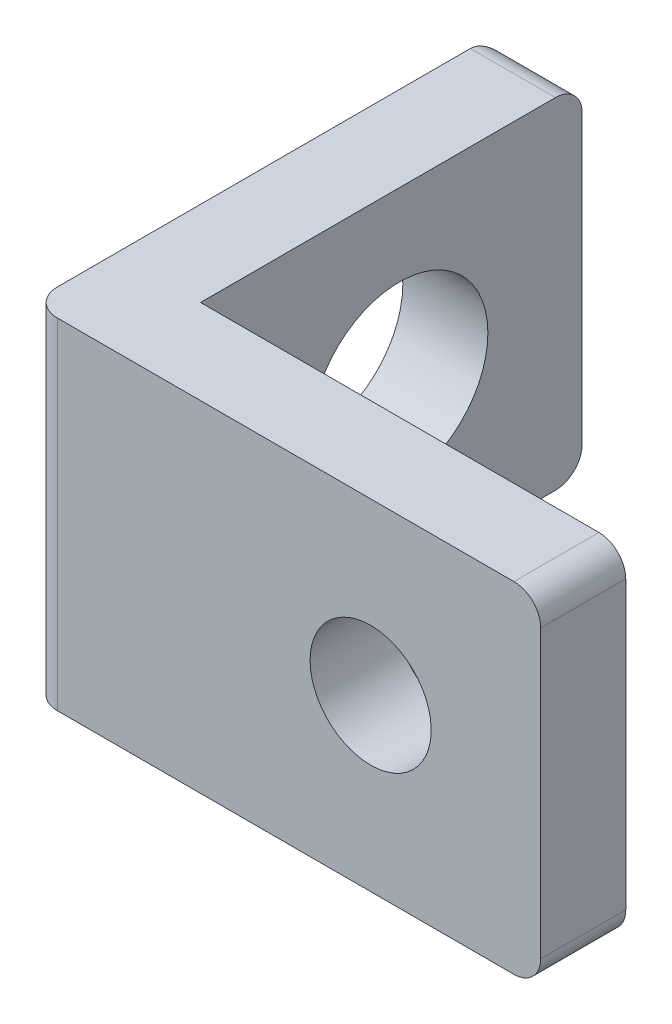
ISO-10303-21;
HEADER;
FILE_DESCRIPTION(('STEP AP214'),'2;1');
FILE_NAME('part.step','',(''),(''),'','','');
FILE_SCHEMA(('AUTOMOTIVE_DESIGN { 1 0 10303 214 1 1 1 1 }'));
ENDSEC;
DATA;
#1=APPLICATION_CONTEXT('core data for automotive mechanical design processes');
#2=APPLICATION_PROTOCOL_DEFINITION('international standard','automotive_design',2000,#1);
#3=PRODUCT_CONTEXT('',#1,'mechanical');
#4=PRODUCT('Part','Part','',(#3));
#5=PRODUCT_RELATED_PRODUCT_CATEGORY('part','',(#4));
#6=PRODUCT_DEFINITION_FORMATION('','',#4);
#7=PRODUCT_DEFINITION_CONTEXT('part definition',#1,'design');
#8=PRODUCT_DEFINITION('design','',#6,#7);
#9=PRODUCT_DEFINITION_SHAPE('','',#8);
#10=(LENGTH_UNIT() NAMED_UNIT(*) SI_UNIT(.MILLI.,.METRE.));
#11=(NAMED_UNIT(*) PLANE_ANGLE_UNIT() SI_UNIT($,.RADIAN.));
#12=(NAMED_UNIT(*) SI_UNIT($,.STERADIAN.) SOLID_ANGLE_UNIT());
#13=UNCERTAINTY_MEASURE_WITH_UNIT(LENGTH_MEASURE(1.E-05),#10,'distance_accuracy_value','');
#14=(GEOMETRIC_REPRESENTATION_CONTEXT(3) GLOBAL_UNCERTAINTY_ASSIGNED_CONTEXT((#13)) GLOBAL_UNIT_ASSIGNED_CONTEXT((#10,
#11,#12)) REPRESENTATION_CONTEXT('',''));
#15=CARTESIAN_POINT('',(0.,0.,0.));
#16=DIRECTION('',(0.,0.,1.));
#17=DIRECTION('',(1.,0.,0.));
#18=AXIS2_PLACEMENT_3D('',#15,#16,#17);
#19=CARTESIAN_POINT('',(1.5875,6.35,0.));
#20=DIRECTION('',(1.,0.,0.));
#21=DIRECTION('',(0.,0.,-1.));
#22=AXIS2_PLACEMENT_3D('',#19,#20,#21);
#23=PLANE('',#22);
#24=CARTESIAN_POINT('',(1.5875,3.175,-5.3));
#25=DIRECTION('',(1.,0.,0.));
#26=DIRECTION('',(0.,0.,-1.));
#27=AXIS2_PLACEMENT_3D('',#24,#25,#26);
#28=CIRCLE('',#27,1.651);
#29=CARTESIAN_POINT('',(1.5875,3.175,-6.951));
#30=VERTEX_POINT('',#29);
#31=EDGE_CURVE('E213',#30,#30,#28,.T.);
#32=ORIENTED_EDGE('',*,*,#31,.F.);
#33=EDGE_LOOP('',(#32));
#34=FACE_BOUND('',#33,.T.);
#35=DIRECTION('',(0.,0.,1.));
#36=VECTOR('',#35,1.);
#37=CARTESIAN_POINT('',(1.5875,0.,0.));
#38=LINE('',#37,#36);
#39=CARTESIAN_POINT('',(1.5875,0.,-8.2122));
#40=VERTEX_POINT('',#39);
#41=CARTESIAN_POINT('',(1.5875,0.,-1.5875));
#42=VERTEX_POINT('',#41);
#43=EDGE_CURVE('E216',#40,#42,#38,.T.);
#44=ORIENTED_EDGE('',*,*,#43,.F.);
#45=CARTESIAN_POINT('',(1.5875,0.5,-8.2122));
#46=DIRECTION('',(1.,0.,0.));
#47=DIRECTION('',(0.,0.,-1.));
#48=AXIS2_PLACEMENT_3D('',#45,#46,#47);
#49=CIRCLE('',#48,0.5);
#50=CARTESIAN_POINT('',(1.5875,0.5,-8.7122));
#51=VERTEX_POINT('',#50);
#52=EDGE_CURVE('E177',#40,#51,#49,.T.);
#53=ORIENTED_EDGE('',*,*,#52,.T.);
#54=DIRECTION('',(0.,-1.,0.));
#55=VECTOR('',#54,1.);
#56=CARTESIAN_POINT('',(1.5875,6.35,-8.7122));
#57=LINE('',#56,#55);
#58=CARTESIAN_POINT('',(1.5875,5.85,-8.7122));
#59=VERTEX_POINT('',#58);
#60=EDGE_CURVE('E156',#59,#51,#57,.T.);
#61=ORIENTED_EDGE('',*,*,#60,.F.);
#62=CARTESIAN_POINT('',(1.5875,5.85,-8.2122));
#63=DIRECTION('',(1.,0.,0.));
#64=DIRECTION('',(0.,0.,-1.));
#65=AXIS2_PLACEMENT_3D('',#62,#63,#64);
#66=CIRCLE('',#65,0.5);
#67=CARTESIAN_POINT('',(1.5875,6.35,-8.2122));
#68=VERTEX_POINT('',#67);
#69=EDGE_CURVE('E140',#59,#68,#66,.T.);
#70=ORIENTED_EDGE('',*,*,#69,.T.);
#71=DIRECTION('',(0.,0.,1.));
#72=VECTOR('',#71,1.);
#73=CARTESIAN_POINT('',(1.5875,6.35,0.));
#74=LINE('',#73,#72);
#75=CARTESIAN_POINT('',(1.5875,6.35,-1.5875));
#76=VERTEX_POINT('',#75);
#77=EDGE_CURVE('E125',#68,#76,#74,.T.);
#78=ORIENTED_EDGE('',*,*,#77,.T.);
#79=DIRECTION('',(0.,-1.,0.));
#80=VECTOR('',#79,1.);
#81=CARTESIAN_POINT('',(1.5875,6.35,-1.5875));
#82=LINE('',#81,#80);
#83=EDGE_CURVE('E132',#76,#42,#82,.T.);
#84=ORIENTED_EDGE('',*,*,#83,.T.);
#85=EDGE_LOOP('',(#44,#53,#61,#70,#78,#84));
#86=FACE_BOUND('',#85,.T.);
#87=ADVANCED_FACE('F36',(#34,#86),#23,.T.);
#88=CARTESIAN_POINT('',(0.,6.35,-8.7122));
#89=DIRECTION('',(0.,0.,-1.));
#90=DIRECTION('',(-1.,0.,0.));
#91=AXIS2_PLACEMENT_3D('',#88,#89,#90);
#92=PLANE('',#91);
#93=ORIENTED_EDGE('',*,*,#60,.T.);
#94=DIRECTION('',(1.,0.,0.));
#95=VECTOR('',#94,1.);
#96=CARTESIAN_POINT('',(0.,0.5,-8.7122));
#97=LINE('',#96,#95);
#98=CARTESIAN_POINT('',(0.5,0.5,-8.7122));
#99=VERTEX_POINT('',#98);
#100=EDGE_CURVE('E168',#51,#99,#97,.F.);
#101=ORIENTED_EDGE('',*,*,#100,.T.);
#102=DIRECTION('',(0.,-1.,0.));
#103=VECTOR('',#102,1.);
#104=CARTESIAN_POINT('',(0.5,6.35,-8.7122));
#105=LINE('',#104,#103);
#106=CARTESIAN_POINT('',(0.5,5.85,-8.7122));
#107=VERTEX_POINT('',#106);
#108=EDGE_CURVE('E166',#99,#107,#105,.F.);
#109=ORIENTED_EDGE('',*,*,#108,.T.);
#110=DIRECTION('',(1.,0.,0.));
#111=VECTOR('',#110,1.);
#112=CARTESIAN_POINT('',(0.,5.85,-8.7122));
#113=LINE('',#112,#111);
#114=EDGE_CURVE('E164',#107,#59,#113,.T.);
#115=ORIENTED_EDGE('',*,*,#114,.T.);
#116=EDGE_LOOP('',(#93,#101,#109,#115));
#117=FACE_BOUND('',#116,.T.);
#118=ADVANCED_FACE('F261',(#117),#92,.T.);
#119=CARTESIAN_POINT('',(0.,6.35,0.));
#120=DIRECTION('',(-1.,0.,0.));
#121=DIRECTION('',(0.,0.,1.));
#122=AXIS2_PLACEMENT_3D('',#119,#120,#121);
#123=PLANE('',#122);
#124=CARTESIAN_POINT('',(0.,3.175,-5.3));
#125=DIRECTION('',(-1.,0.,0.));
#126=DIRECTION('',(0.,0.,1.));
#127=AXIS2_PLACEMENT_3D('',#124,#125,#126);
#128=CIRCLE('',#127,1.651);
#129=CARTESIAN_POINT('',(0.,3.175,-6.951));
#130=VERTEX_POINT('',#129);
#131=EDGE_CURVE('E210',#130,#130,#128,.F.);
#132=ORIENTED_EDGE('',*,*,#131,.T.);
#133=EDGE_LOOP('',(#132));
#134=FACE_BOUND('',#133,.T.);
#135=DIRECTION('',(0.,0.,-1.));
#136=VECTOR('',#135,1.);
#137=CARTESIAN_POINT('',(0.,6.35,0.));
#138=LINE('',#137,#136);
#139=CARTESIAN_POINT('',(0.,6.35,-0.5));
#140=VERTEX_POINT('',#139);
#141=CARTESIAN_POINT('',(0.,6.35,-8.2122));
#142=VERTEX_POINT('',#141);
#143=EDGE_CURVE('E141',#140,#142,#138,.T.);
#144=ORIENTED_EDGE('',*,*,#143,.T.);
#145=DIRECTION('',(0.,-1.,0.));
#146=VECTOR('',#145,1.);
#147=CARTESIAN_POINT('',(0.,6.35,-8.2122));
#148=LINE('',#147,#146);
#149=CARTESIAN_POINT('',(0.,0.,-8.2122));
#150=VERTEX_POINT('',#149);
#151=EDGE_CURVE('E161',#142,#150,#148,.T.);
#152=ORIENTED_EDGE('',*,*,#151,.T.);
#153=DIRECTION('',(0.,0.,-1.));
#154=VECTOR('',#153,1.);
#155=CARTESIAN_POINT('',(0.,0.,0.));
#156=LINE('',#155,#154);
#157=CARTESIAN_POINT('',(0.,0.,-0.5));
#158=VERTEX_POINT('',#157);
#159=EDGE_CURVE('E223',#158,#150,#156,.T.);
#160=ORIENTED_EDGE('',*,*,#159,.F.);
#161=DIRECTION('',(0.,-1.,0.));
#162=VECTOR('',#161,1.);
#163=CARTESIAN_POINT('',(0.,6.35,-0.5));
#164=LINE('',#163,#162);
#165=EDGE_CURVE('E159',#158,#140,#164,.F.);
#166=ORIENTED_EDGE('',*,*,#165,.T.);
#167=EDGE_LOOP('',(#144,#152,#160,#166));
#168=FACE_BOUND('',#167,.T.);
#169=ADVANCED_FACE('F246',(#134,#168),#123,.T.);
#170=CARTESIAN_POINT('',(0.,6.35,0.));
#171=DIRECTION('',(0.,0.,-1.));
#172=DIRECTION('',(-1.,0.,0.));
#173=AXIS2_PLACEMENT_3D('',#170,#171,#172);
#174=PLANE('',#173);
#175=CARTESIAN_POINT('',(6.35,3.175,0.));
#176=DIRECTION('',(0.,0.,-1.));
#177=DIRECTION('',(-1.,0.,0.));
#178=AXIS2_PLACEMENT_3D('',#175,#176,#177);
#179=CIRCLE('',#178,1.1303);
#180=CARTESIAN_POINT('',(5.2197,3.175,0.));
#181=VERTEX_POINT('',#180);
#182=EDGE_CURVE('E205',#181,#181,#179,.T.);
#183=ORIENTED_EDGE('',*,*,#182,.T.);
#184=EDGE_LOOP('',(#183));
#185=FACE_BOUND('',#184,.T.);
#186=DIRECTION('',(1.,0.,0.));
#187=VECTOR('',#186,1.);
#188=CARTESIAN_POINT('',(0.,0.,0.));
#189=LINE('',#188,#187);
#190=CARTESIAN_POINT('',(0.5,0.,0.));
#191=VERTEX_POINT('',#190);
#192=CARTESIAN_POINT('',(9.025,0.,0.));
#193=VERTEX_POINT('',#192);
#194=EDGE_CURVE('E225',#191,#193,#189,.T.);
#195=ORIENTED_EDGE('',*,*,#194,.T.);
#196=CARTESIAN_POINT('',(9.025,0.5,0.));
#197=DIRECTION('',(0.,0.,-1.));
#198=DIRECTION('',(-1.,0.,0.));
#199=AXIS2_PLACEMENT_3D('',#196,#197,#198);
#200=CIRCLE('',#199,0.5);
#201=CARTESIAN_POINT('',(9.525,0.5,0.));
#202=VERTEX_POINT('',#201);
#203=EDGE_CURVE('E11',#193,#202,#200,.F.);
#204=ORIENTED_EDGE('',*,*,#203,.T.);
#205=DIRECTION('',(0.,-1.,0.));
#206=VECTOR('',#205,1.);
#207=CARTESIAN_POINT('',(9.525,6.35,0.));
#208=LINE('',#207,#206);
#209=CARTESIAN_POINT('',(9.525,5.85,0.));
#210=VERTEX_POINT('',#209);
#211=EDGE_CURVE('E150',#210,#202,#208,.T.);
#212=ORIENTED_EDGE('',*,*,#211,.F.);
#213=CARTESIAN_POINT('',(9.025,5.85,0.));
#214=DIRECTION('',(0.,0.,-1.));
#215=DIRECTION('',(-1.,0.,0.));
#216=AXIS2_PLACEMENT_3D('',#213,#214,#215);
#217=CIRCLE('',#216,0.5);
#218=CARTESIAN_POINT('',(9.025,6.35,0.));
#219=VERTEX_POINT('',#218);
#220=EDGE_CURVE('E45',#210,#219,#217,.F.);
#221=ORIENTED_EDGE('',*,*,#220,.T.);
#222=DIRECTION('',(1.,0.,0.));
#223=VECTOR('',#222,1.);
#224=CARTESIAN_POINT('',(0.,6.35,0.));
#225=LINE('',#224,#223);
#226=CARTESIAN_POINT('',(0.5,6.35,0.));
#227=VERTEX_POINT('',#226);
#228=EDGE_CURVE('E133',#227,#219,#225,.T.);
#229=ORIENTED_EDGE('',*,*,#228,.F.);
#230=DIRECTION('',(0.,-1.,0.));
#231=VECTOR('',#230,1.);
#232=CARTESIAN_POINT('',(0.5,0.,0.));
#233=LINE('',#232,#231);
#234=EDGE_CURVE('E192',#227,#191,#233,.T.);
#235=ORIENTED_EDGE('',*,*,#234,.T.);
#236=EDGE_LOOP('',(#195,#204,#212,#221,#229,#235));
#237=FACE_BOUND('',#236,.T.);
#238=ADVANCED_FACE('F227',(#185,#237),#174,.F.);
#239=CARTESIAN_POINT('',(9.525,6.35,0.));
#240=DIRECTION('',(-1.,0.,0.));
#241=DIRECTION('',(0.,0.,1.));
#242=AXIS2_PLACEMENT_3D('',#239,#240,#241);
#243=PLANE('',#242);
#244=ORIENTED_EDGE('',*,*,#211,.T.);
#245=DIRECTION('',(0.,0.,-1.));
#246=VECTOR('',#245,1.);
#247=CARTESIAN_POINT('',(9.525,0.5,0.));
#248=LINE('',#247,#246);
#249=CARTESIAN_POINT('',(9.525,0.5,-1.5875));
#250=VERTEX_POINT('',#249);
#251=EDGE_CURVE('E185',#202,#250,#248,.T.);
#252=ORIENTED_EDGE('',*,*,#251,.T.);
#253=DIRECTION('',(0.,-1.,0.));
#254=VECTOR('',#253,1.);
#255=CARTESIAN_POINT('',(9.525,6.35,-1.5875));
#256=LINE('',#255,#254);
#257=CARTESIAN_POINT('',(9.525,5.85,-1.5875));
#258=VERTEX_POINT('',#257);
#259=EDGE_CURVE('E148',#258,#250,#256,.T.);
#260=ORIENTED_EDGE('',*,*,#259,.F.);
#261=DIRECTION('',(0.,0.,-1.));
#262=VECTOR('',#261,1.);
#263=CARTESIAN_POINT('',(9.525,5.85,0.));
#264=LINE('',#263,#262);
#265=EDGE_CURVE('E58',#258,#210,#264,.F.);
#266=ORIENTED_EDGE('',*,*,#265,.T.);
#267=EDGE_LOOP('',(#244,#252,#260,#266));
#268=FACE_BOUND('',#267,.T.);
#269=ADVANCED_FACE('F235',(#268),#243,.F.);
#270=CARTESIAN_POINT('',(0.,6.35,-1.5875));
#271=DIRECTION('',(0.,0.,1.));
#272=DIRECTION('',(1.,0.,0.));
#273=AXIS2_PLACEMENT_3D('',#270,#271,#272);
#274=PLANE('',#273);
#275=CARTESIAN_POINT('',(6.35,3.175,-1.5875));
#276=DIRECTION('',(0.,0.,-1.));
#277=DIRECTION('',(-1.,0.,0.));
#278=AXIS2_PLACEMENT_3D('',#275,#276,#277);
#279=CIRCLE('',#278,1.1303);
#280=CARTESIAN_POINT('',(5.2197,3.175,-1.5875));
#281=VERTEX_POINT('',#280);
#282=EDGE_CURVE('E202',#281,#281,#279,.T.);
#283=ORIENTED_EDGE('',*,*,#282,.F.);
#284=EDGE_LOOP('',(#283));
#285=FACE_BOUND('',#284,.T.);
#286=ORIENTED_EDGE('',*,*,#259,.T.);
#287=CARTESIAN_POINT('',(9.025,0.5,-1.5875));
#288=DIRECTION('',(0.,0.,1.));
#289=DIRECTION('',(1.,0.,0.));
#290=AXIS2_PLACEMENT_3D('',#287,#288,#289);
#291=CIRCLE('',#290,0.5);
#292=CARTESIAN_POINT('',(9.025,0.,-1.5875));
#293=VERTEX_POINT('',#292);
#294=EDGE_CURVE('E190',#250,#293,#291,.F.);
#295=ORIENTED_EDGE('',*,*,#294,.T.);
#296=DIRECTION('',(-1.,0.,0.));
#297=VECTOR('',#296,1.);
#298=CARTESIAN_POINT('',(0.,0.,-1.5875));
#299=LINE('',#298,#297);
#300=EDGE_CURVE('E142',#293,#42,#299,.T.);
#301=ORIENTED_EDGE('',*,*,#300,.T.);
#302=ORIENTED_EDGE('',*,*,#83,.F.);
#303=DIRECTION('',(-1.,0.,0.));
#304=VECTOR('',#303,1.);
#305=CARTESIAN_POINT('',(0.,6.35,-1.5875));
#306=LINE('',#305,#304);
#307=CARTESIAN_POINT('',(9.025,6.35,-1.5875));
#308=VERTEX_POINT('',#307);
#309=EDGE_CURVE('E122',#308,#76,#306,.T.);
#310=ORIENTED_EDGE('',*,*,#309,.F.);
#311=CARTESIAN_POINT('',(9.025,5.85,-1.5875));
#312=DIRECTION('',(0.,0.,1.));
#313=DIRECTION('',(1.,0.,0.));
#314=AXIS2_PLACEMENT_3D('',#311,#312,#313);
#315=CIRCLE('',#314,0.5);
#316=EDGE_CURVE('E188',#308,#258,#315,.F.);
#317=ORIENTED_EDGE('',*,*,#316,.T.);
#318=EDGE_LOOP('',(#286,#295,#301,#302,#310,#317));
#319=FACE_BOUND('',#318,.T.);
#320=ADVANCED_FACE('F145',(#285,#319),#274,.F.);
#321=CARTESIAN_POINT('',(0.,6.35,0.));
#322=DIRECTION('',(0.,1.,0.));
#323=DIRECTION('',(0.,0.,1.));
#324=AXIS2_PLACEMENT_3D('',#321,#322,#323);
#325=PLANE('',#324);
#326=ORIENTED_EDGE('',*,*,#77,.F.);
#327=DIRECTION('',(1.,0.,0.));
#328=VECTOR('',#327,1.);
#329=CARTESIAN_POINT('',(0.,6.35,-8.2122));
#330=LINE('',#329,#328);
#331=EDGE_CURVE('E182',#68,#142,#330,.F.);
#332=ORIENTED_EDGE('',*,*,#331,.T.);
#333=ORIENTED_EDGE('',*,*,#143,.F.);
#334=CARTESIAN_POINT('',(0.5,6.35,-0.5));
#335=DIRECTION('',(0.,1.,0.));
#336=DIRECTION('',(0.,0.,1.));
#337=AXIS2_PLACEMENT_3D('',#334,#335,#336);
#338=CIRCLE('',#337,0.5);
#339=EDGE_CURVE('E179',#140,#227,#338,.T.);
#340=ORIENTED_EDGE('',*,*,#339,.T.);
#341=ORIENTED_EDGE('',*,*,#228,.T.);
#342=DIRECTION('',(0.,0.,-1.));
#343=VECTOR('',#342,1.);
#344=CARTESIAN_POINT('',(9.025,6.35,-1.5875));
#345=LINE('',#344,#343);
#346=EDGE_CURVE('E129',#219,#308,#345,.T.);
#347=ORIENTED_EDGE('',*,*,#346,.T.);
#348=ORIENTED_EDGE('',*,*,#309,.T.);
#349=EDGE_LOOP('',(#326,#332,#333,#340,#341,#347,#348));
#350=FACE_BOUND('',#349,.T.);
#351=ADVANCED_FACE('F124',(#350),#325,.T.);
#352=CARTESIAN_POINT('',(0.,0.,0.));
#353=DIRECTION('',(0.,1.,0.));
#354=DIRECTION('',(0.,0.,1.));
#355=AXIS2_PLACEMENT_3D('',#352,#353,#354);
#356=PLANE('',#355);
#357=ORIENTED_EDGE('',*,*,#159,.T.);
#358=DIRECTION('',(1.,0.,0.));
#359=VECTOR('',#358,1.);
#360=CARTESIAN_POINT('',(1.5875,0.,-8.2122));
#361=LINE('',#360,#359);
#362=EDGE_CURVE('E174',#150,#40,#361,.T.);
#363=ORIENTED_EDGE('',*,*,#362,.T.);
#364=ORIENTED_EDGE('',*,*,#43,.T.);
#365=ORIENTED_EDGE('',*,*,#300,.F.);
#366=DIRECTION('',(0.,0.,-1.));
#367=VECTOR('',#366,1.);
#368=CARTESIAN_POINT('',(9.025,0.,0.));
#369=LINE('',#368,#367);
#370=EDGE_CURVE('E172',#293,#193,#369,.F.);
#371=ORIENTED_EDGE('',*,*,#370,.T.);
#372=ORIENTED_EDGE('',*,*,#194,.F.);
#373=CARTESIAN_POINT('',(0.5,0.,-0.5));
#374=DIRECTION('',(0.,1.,0.));
#375=DIRECTION('',(0.,0.,1.));
#376=AXIS2_PLACEMENT_3D('',#373,#374,#375);
#377=CIRCLE('',#376,0.5);
#378=EDGE_CURVE('E170',#191,#158,#377,.F.);
#379=ORIENTED_EDGE('',*,*,#378,.T.);
#380=EDGE_LOOP('',(#357,#363,#364,#365,#371,#372,#379));
#381=FACE_BOUND('',#380,.T.);
#382=ADVANCED_FACE('F244',(#381),#356,.F.);
#383=CARTESIAN_POINT('',(-0.00100000000000122,3.175,-5.3));
#384=DIRECTION('',(1.,0.,0.));
#385=DIRECTION('',(0.,0.,-1.));
#386=AXIS2_PLACEMENT_3D('',#383,#384,#385);
#387=CYLINDRICAL_SURFACE('',#386,1.651);
#388=CARTESIAN_POINT('',(0.,3.175,-6.951));
#389=CARTESIAN_POINT('',(0.0165364583333333,3.175,-6.951));
#390=CARTESIAN_POINT('',(0.0330729166666667,3.175,-6.951));
#391=CARTESIAN_POINT('',(0.0661458333333334,3.175,-6.951));
#392=CARTESIAN_POINT('',(0.0826822916666667,3.175,-6.951));
#393=CARTESIAN_POINT('',(0.115755208333333,3.175,-6.951));
#394=CARTESIAN_POINT('',(0.132291666666667,3.175,-6.951));
#395=CARTESIAN_POINT('',(0.165364583333333,3.175,-6.951));
#396=CARTESIAN_POINT('',(0.181901041666667,3.175,-6.951));
#397=CARTESIAN_POINT('',(0.214973958333333,3.175,-6.951));
#398=CARTESIAN_POINT('',(0.231510416666667,3.175,-6.951));
#399=CARTESIAN_POINT('',(0.264583333333333,3.175,-6.951));
#400=CARTESIAN_POINT('',(0.281119791666667,3.175,-6.951));
#401=CARTESIAN_POINT('',(0.314192708333333,3.175,-6.951));
#402=CARTESIAN_POINT('',(0.330729166666667,3.175,-6.951));
#403=CARTESIAN_POINT('',(0.363802083333334,3.175,-6.951));
#404=CARTESIAN_POINT('',(0.380338541666667,3.175,-6.951));
#405=CARTESIAN_POINT('',(0.413411458333334,3.175,-6.951));
#406=CARTESIAN_POINT('',(0.429947916666667,3.175,-6.951));
#407=CARTESIAN_POINT('',(0.463020833333334,3.175,-6.951));
#408=CARTESIAN_POINT('',(0.479557291666667,3.175,-6.951));
#409=CARTESIAN_POINT('',(0.512630208333334,3.175,-6.951));
#410=CARTESIAN_POINT('',(0.529166666666667,3.175,-6.951));
#411=CARTESIAN_POINT('',(0.562239583333334,3.175,-6.951));
#412=CARTESIAN_POINT('',(0.578776041666667,3.175,-6.951));
#413=CARTESIAN_POINT('',(0.611848958333334,3.175,-6.951));
#414=CARTESIAN_POINT('',(0.628385416666667,3.175,-6.951));
#415=CARTESIAN_POINT('',(0.661458333333334,3.175,-6.951));
#416=CARTESIAN_POINT('',(0.677994791666667,3.175,-6.951));
#417=CARTESIAN_POINT('',(0.711067708333334,3.175,-6.951));
#418=CARTESIAN_POINT('',(0.727604166666667,3.175,-6.951));
#419=CARTESIAN_POINT('',(0.760677083333334,3.175,-6.951));
#420=CARTESIAN_POINT('',(0.777213541666667,3.175,-6.951));
#421=CARTESIAN_POINT('',(0.810286458333334,3.175,-6.951));
#422=CARTESIAN_POINT('',(0.826822916666667,3.175,-6.951));
#423=CARTESIAN_POINT('',(0.859895833333334,3.175,-6.951));
#424=CARTESIAN_POINT('',(0.876432291666667,3.175,-6.951));
#425=CARTESIAN_POINT('',(0.909505208333334,3.175,-6.951));
#426=CARTESIAN_POINT('',(0.926041666666667,3.175,-6.951));
#427=CARTESIAN_POINT('',(0.959114583333334,3.175,-6.951));
#428=CARTESIAN_POINT('',(0.975651041666667,3.175,-6.951));
#429=CARTESIAN_POINT('',(1.00872395833333,3.175,-6.951));
#430=CARTESIAN_POINT('',(1.02526041666667,3.175,-6.951));
#431=CARTESIAN_POINT('',(1.05833333333333,3.175,-6.951));
#432=CARTESIAN_POINT('',(1.07486979166667,3.175,-6.951));
#433=CARTESIAN_POINT('',(1.10794270833333,3.175,-6.951));
#434=CARTESIAN_POINT('',(1.12447916666667,3.175,-6.951));
#435=CARTESIAN_POINT('',(1.15755208333333,3.175,-6.951));
#436=CARTESIAN_POINT('',(1.17408854166667,3.175,-6.951));
#437=CARTESIAN_POINT('',(1.20716145833333,3.175,-6.951));
#438=CARTESIAN_POINT('',(1.22369791666667,3.175,-6.951));
#439=CARTESIAN_POINT('',(1.25677083333333,3.175,-6.951));
#440=CARTESIAN_POINT('',(1.27330729166667,3.175,-6.951));
#441=CARTESIAN_POINT('',(1.30638020833333,3.175,-6.951));
#442=CARTESIAN_POINT('',(1.32291666666667,3.175,-6.951));
#443=CARTESIAN_POINT('',(1.35598958333333,3.175,-6.951));
#444=CARTESIAN_POINT('',(1.37252604166667,3.175,-6.951));
#445=CARTESIAN_POINT('',(1.40559895833333,3.175,-6.951));
#446=CARTESIAN_POINT('',(1.42213541666667,3.175,-6.951));
#447=CARTESIAN_POINT('',(1.45520833333333,3.175,-6.951));
#448=CARTESIAN_POINT('',(1.47174479166667,3.175,-6.951));
#449=CARTESIAN_POINT('',(1.50481770833333,3.175,-6.951));
#450=CARTESIAN_POINT('',(1.52135416666667,3.175,-6.951));
#451=CARTESIAN_POINT('',(1.55442708333333,3.175,-6.951));
#452=CARTESIAN_POINT('',(1.57096354166667,3.175,-6.951));
#453=CARTESIAN_POINT('',(1.5875,3.175,-6.951));
#454=B_SPLINE_CURVE_WITH_KNOTS('',3,(#388,#389,#390,#391,#392,#393,#394,#395,#396,#397,#398,
#399,#400,#401,#402,#403,#404,#405,#406,#407,#408,#409,#410,#411,#412,#413,#414,#415,#416,#417,
#418,#419,#420,#421,#422,#423,#424,#425,#426,#427,#428,#429,#430,#431,#432,#433,#434,#435,#436,
#437,#438,#439,#440,#441,#442,#443,#444,#445,#446,#447,#448,#449,#450,#451,#452,#453),
.UNSPECIFIED.,.F.,.F.,(4,2,2,2,2,2,2,2,2,2,2,2,2,2,2,2,2,2,2,2,2,2,2,2,2,2,2,2,2,2,2,2,4),(0.,
0.049609375,0.09921875,0.148828125,0.1984375,0.248046875,0.29765625,0.347265625,0.396875,
0.446484375,0.49609375,0.545703125,0.5953125,0.644921875,0.69453125,0.744140625,0.79375,
0.843359375,0.89296875,0.942578125,0.9921875,1.041796875,1.09140625,1.141015625,1.190625,
1.240234375,1.28984375,1.339453125,1.3890625,1.438671875,1.48828125,1.537890625,1.5875),.UNSPECIFIED.);
#455=EDGE_CURVE('BSEAM283',#130,#30,#454,.T.);
#456=ORIENTED_EDGE('',*,*,#131,.F.);
#457=ORIENTED_EDGE('',*,*,#31,.T.);
#458=ORIENTED_EDGE('',*,*,#455,.T.);
#459=ORIENTED_EDGE('',*,*,#455,.F.);
#460=EDGE_LOOP('',(#456,#458,#457,#459));
#461=FACE_BOUND('',#460,.T.);
#462=ADVANCED_FACE('F283',(#461),#387,.F.);
#463=CARTESIAN_POINT('',(6.35,3.175,-1.5875));
#464=DIRECTION('',(0.,0.,-1.));
#465=DIRECTION('',(-1.,0.,0.));
#466=AXIS2_PLACEMENT_3D('',#463,#464,#465);
#467=CYLINDRICAL_SURFACE('',#466,1.1303);
#468=ORIENTED_EDGE('',*,*,#182,.F.);
#469=EDGE_LOOP('',(#468));
#470=FACE_BOUND('',#469,.T.);
#471=ORIENTED_EDGE('',*,*,#282,.T.);
#472=EDGE_LOOP('',(#471));
#473=FACE_BOUND('',#472,.T.);
#474=ADVANCED_FACE('F288',(#470,#473),#467,.F.);
#475=CARTESIAN_POINT('',(0.,5.85,-8.2122));
#476=DIRECTION('',(1.,0.,0.));
#477=DIRECTION('',(0.,0.,-1.));
#478=AXIS2_PLACEMENT_3D('',#475,#476,#477);
#479=CYLINDRICAL_SURFACE('',#478,0.5);
#480=ORIENTED_EDGE('',*,*,#69,.F.);
#481=ORIENTED_EDGE('',*,*,#114,.F.);
#482=CARTESIAN_POINT('',(0.5,5.85,-8.2122));
#483=DIRECTION('',(0.707106781186547,0.707106781186547,0.));
#484=DIRECTION('',(0.707106781186547,-0.707106781186547,0.));
#485=AXIS2_PLACEMENT_3D('',#482,#483,#484);
#486=ELLIPSE('',#485,0.707106781186547,0.5);
#487=EDGE_CURVE('E40',#142,#107,#486,.F.);
#488=ORIENTED_EDGE('',*,*,#487,.F.);
#489=ORIENTED_EDGE('',*,*,#331,.F.);
#490=EDGE_LOOP('',(#480,#481,#488,#489));
#491=FACE_BOUND('',#490,.T.);
#492=ADVANCED_FACE('F256',(#491),#479,.T.);
#493=CARTESIAN_POINT('',(0.,0.5,-8.2122));
#494=DIRECTION('',(-1.,0.,0.));
#495=DIRECTION('',(0.,0.,1.));
#496=AXIS2_PLACEMENT_3D('',#493,#494,#495);
#497=CYLINDRICAL_SURFACE('',#496,0.5);
#498=ORIENTED_EDGE('',*,*,#52,.F.);
#499=ORIENTED_EDGE('',*,*,#362,.F.);
#500=CARTESIAN_POINT('',(0.5,0.5,-8.2122));
#501=DIRECTION('',(-0.707106781186547,0.707106781186547,0.));
#502=DIRECTION('',(-0.707106781186547,-0.707106781186547,0.));
#503=AXIS2_PLACEMENT_3D('',#500,#501,#502);
#504=ELLIPSE('',#503,0.707106781186547,0.5);
#505=EDGE_CURVE('E195',#99,#150,#504,.T.);
#506=ORIENTED_EDGE('',*,*,#505,.F.);
#507=ORIENTED_EDGE('',*,*,#100,.F.);
#508=EDGE_LOOP('',(#498,#499,#506,#507));
#509=FACE_BOUND('',#508,.T.);
#510=ADVANCED_FACE('F249',(#509),#497,.T.);
#511=CARTESIAN_POINT('',(0.5,6.35,-8.2122));
#512=DIRECTION('',(0.,-1.,0.));
#513=DIRECTION('',(0.,0.,-1.));
#514=AXIS2_PLACEMENT_3D('',#511,#512,#513);
#515=CYLINDRICAL_SURFACE('',#514,0.5);
#516=ORIENTED_EDGE('',*,*,#487,.T.);
#517=ORIENTED_EDGE('',*,*,#108,.F.);
#518=ORIENTED_EDGE('',*,*,#505,.T.);
#519=ORIENTED_EDGE('',*,*,#151,.F.);
#520=EDGE_LOOP('',(#516,#517,#518,#519));
#521=FACE_BOUND('',#520,.T.);
#522=ADVANCED_FACE('F247',(#521),#515,.T.);
#523=CARTESIAN_POINT('',(9.025,0.5,0.));
#524=DIRECTION('',(0.,0.,-1.));
#525=DIRECTION('',(-1.,0.,0.));
#526=AXIS2_PLACEMENT_3D('',#523,#524,#525);
#527=CYLINDRICAL_SURFACE('',#526,0.5);
#528=ORIENTED_EDGE('',*,*,#203,.F.);
#529=ORIENTED_EDGE('',*,*,#370,.F.);
#530=ORIENTED_EDGE('',*,*,#294,.F.);
#531=ORIENTED_EDGE('',*,*,#251,.F.);
#532=EDGE_LOOP('',(#528,#529,#530,#531));
#533=FACE_BOUND('',#532,.T.);
#534=ADVANCED_FACE('F234',(#533),#527,.T.);
#535=CARTESIAN_POINT('',(9.025,5.85,0.));
#536=DIRECTION('',(0.,0.,1.));
#537=DIRECTION('',(1.,0.,0.));
#538=AXIS2_PLACEMENT_3D('',#535,#536,#537);
#539=CYLINDRICAL_SURFACE('',#538,0.5);
#540=ORIENTED_EDGE('',*,*,#220,.F.);
#541=ORIENTED_EDGE('',*,*,#265,.F.);
#542=ORIENTED_EDGE('',*,*,#316,.F.);
#543=ORIENTED_EDGE('',*,*,#346,.F.);
#544=EDGE_LOOP('',(#540,#541,#542,#543));
#545=FACE_BOUND('',#544,.T.);
#546=ADVANCED_FACE('F238',(#545),#539,.T.);
#547=CARTESIAN_POINT('',(0.5,6.35,-0.5));
#548=DIRECTION('',(0.,1.,0.));
#549=DIRECTION('',(0.,0.,1.));
#550=AXIS2_PLACEMENT_3D('',#547,#548,#549);
#551=CYLINDRICAL_SURFACE('',#550,0.5);
#552=ORIENTED_EDGE('',*,*,#339,.F.);
#553=ORIENTED_EDGE('',*,*,#165,.F.);
#554=ORIENTED_EDGE('',*,*,#378,.F.);
#555=ORIENTED_EDGE('',*,*,#234,.F.);
#556=EDGE_LOOP('',(#552,#553,#554,#555));
#557=FACE_BOUND('',#556,.T.);
#558=ADVANCED_FACE('F38',(#557),#551,.T.);
#559=CLOSED_SHELL('',(#87,#118,#169,#238,#269,#320,#351,#382,#462,#474,#492,#510,#522,#534,#546,#558));
#560=MANIFOLD_SOLID_BREP('B2',#559);
#561=ADVANCED_BREP_SHAPE_REPRESENTATION('',(#18,#560),#14);
#562=SHAPE_DEFINITION_REPRESENTATION(#9,#561);
ENDSEC;
END-ISO-10303-21;
